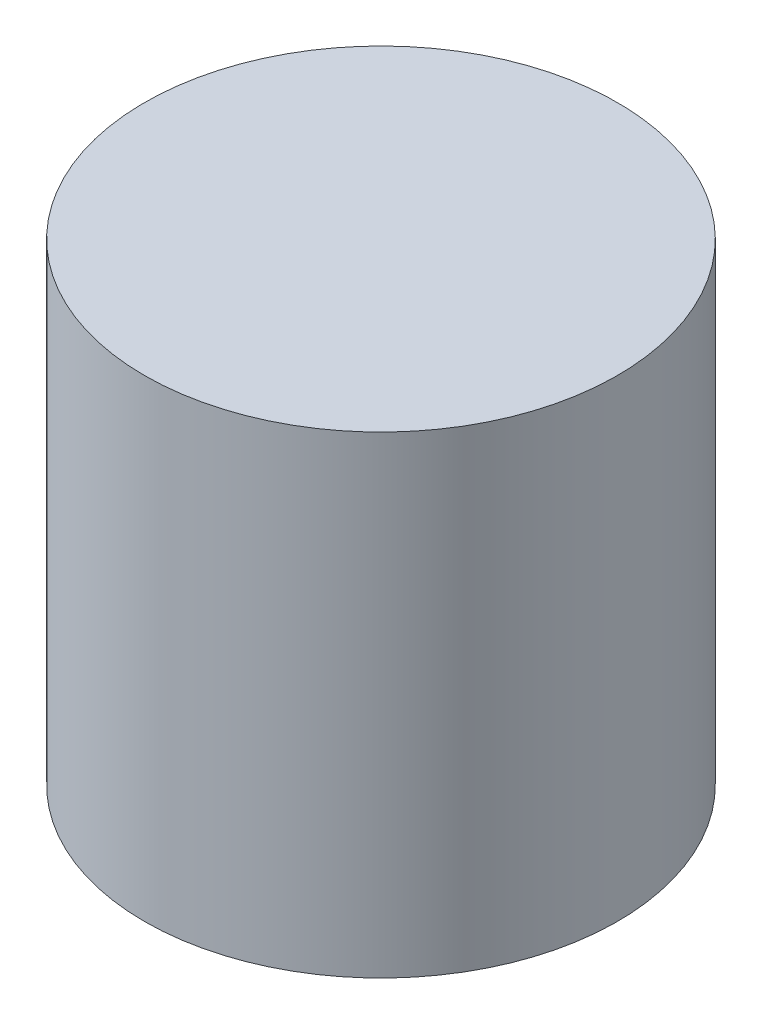
ISO-10303-21;
HEADER;
FILE_DESCRIPTION(('STEP AP214'),'2;1');
FILE_NAME('part.step','',(''),(''),'','','');
FILE_SCHEMA(('AUTOMOTIVE_DESIGN { 1 0 10303 214 1 1 1 1 }'));
ENDSEC;
DATA;
#1=APPLICATION_CONTEXT('core data for automotive mechanical design processes');
#2=APPLICATION_PROTOCOL_DEFINITION('international standard','automotive_design',2000,#1);
#3=PRODUCT_CONTEXT('',#1,'mechanical');
#4=PRODUCT('Part','Part','',(#3));
#5=PRODUCT_RELATED_PRODUCT_CATEGORY('part','',(#4));
#6=PRODUCT_DEFINITION_FORMATION('','',#4);
#7=PRODUCT_DEFINITION_CONTEXT('part definition',#1,'design');
#8=PRODUCT_DEFINITION('design','',#6,#7);
#9=PRODUCT_DEFINITION_SHAPE('','',#8);
#10=(LENGTH_UNIT() NAMED_UNIT(*) SI_UNIT(.MILLI.,.METRE.));
#11=(NAMED_UNIT(*) PLANE_ANGLE_UNIT() SI_UNIT($,.RADIAN.));
#12=(NAMED_UNIT(*) SI_UNIT($,.STERADIAN.) SOLID_ANGLE_UNIT());
#13=UNCERTAINTY_MEASURE_WITH_UNIT(LENGTH_MEASURE(1.E-05),#10,'distance_accuracy_value','');
#14=(GEOMETRIC_REPRESENTATION_CONTEXT(3) GLOBAL_UNCERTAINTY_ASSIGNED_CONTEXT((#13)) GLOBAL_UNIT_ASSIGNED_CONTEXT((#10,
#11,#12)) REPRESENTATION_CONTEXT('',''));
#15=CARTESIAN_POINT('',(0.,0.,0.));
#16=DIRECTION('',(0.,0.,1.));
#17=DIRECTION('',(1.,0.,0.));
#18=AXIS2_PLACEMENT_3D('',#15,#16,#17);
#19=CARTESIAN_POINT('',(0.,3.,0.));
#20=DIRECTION('',(0.,-1.,0.));
#21=DIRECTION('',(0.,0.,-1.));
#22=AXIS2_PLACEMENT_3D('',#19,#20,#21);
#23=CYLINDRICAL_SURFACE('',#22,1.5);
#24=CARTESIAN_POINT('',(0.,3.,0.));
#25=DIRECTION('',(0.,1.,0.));
#26=DIRECTION('',(0.,0.,1.));
#27=AXIS2_PLACEMENT_3D('',#24,#25,#26);
#28=CIRCLE('',#27,1.5);
#29=CARTESIAN_POINT('',(0.,3.,1.5));
#30=VERTEX_POINT('',#29);
#31=EDGE_CURVE('E10',#30,#30,#28,.T.);
#32=ORIENTED_EDGE('',*,*,#31,.F.);
#33=EDGE_LOOP('',(#32));
#34=FACE_BOUND('',#33,.T.);
#35=CARTESIAN_POINT('',(0.,0.,0.));
#36=DIRECTION('',(0.,1.,0.));
#37=DIRECTION('',(0.,0.,1.));
#38=AXIS2_PLACEMENT_3D('',#35,#36,#37);
#39=CIRCLE('',#38,1.5);
#40=CARTESIAN_POINT('',(0.,0.,1.5));
#41=VERTEX_POINT('',#40);
#42=EDGE_CURVE('E34',#41,#41,#39,.T.);
#43=ORIENTED_EDGE('',*,*,#42,.T.);
#44=EDGE_LOOP('',(#43));
#45=FACE_BOUND('',#44,.T.);
#46=ADVANCED_FACE('F31',(#34,#45),#23,.T.);
#47=CARTESIAN_POINT('',(0.,3.,0.));
#48=DIRECTION('',(0.,1.,0.));
#49=DIRECTION('',(0.,0.,1.));
#50=AXIS2_PLACEMENT_3D('',#47,#48,#49);
#51=PLANE('',#50);
#52=ORIENTED_EDGE('',*,*,#31,.T.);
#53=EDGE_LOOP('',(#52));
#54=FACE_BOUND('',#53,.T.);
#55=ADVANCED_FACE('F46',(#54),#51,.T.);
#56=CARTESIAN_POINT('',(0.,0.,0.));
#57=DIRECTION('',(0.,1.,0.));
#58=DIRECTION('',(0.,0.,1.));
#59=AXIS2_PLACEMENT_3D('',#56,#57,#58);
#60=PLANE('',#59);
#61=ORIENTED_EDGE('',*,*,#42,.F.);
#62=EDGE_LOOP('',(#61));
#63=FACE_BOUND('',#62,.T.);
#64=ADVANCED_FACE('F44',(#63),#60,.F.);
#65=CLOSED_SHELL('',(#46,#55,#64));
#66=MANIFOLD_SOLID_BREP('B2',#65);
#67=ADVANCED_BREP_SHAPE_REPRESENTATION('',(#18,#66),#14);
#68=SHAPE_DEFINITION_REPRESENTATION(#9,#67);
ENDSEC;
END-ISO-10303-21;
